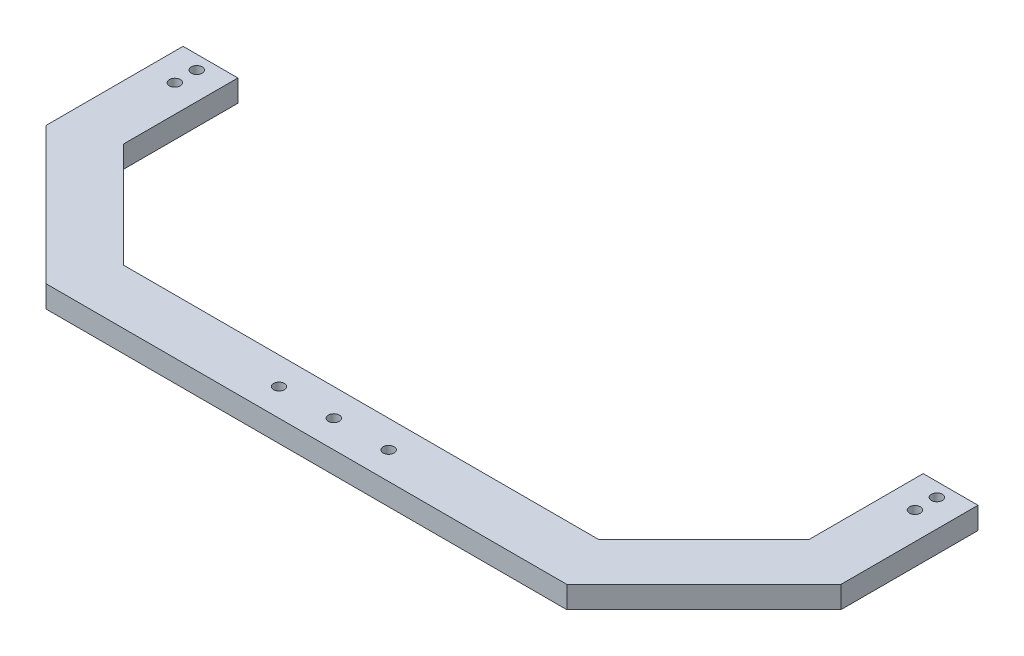
ISO-10303-21;
HEADER;
FILE_DESCRIPTION(('STEP AP214'),'2;1');
FILE_NAME('part.step','',(''),(''),'','','');
FILE_SCHEMA(('AUTOMOTIVE_DESIGN { 1 0 10303 214 1 1 1 1 }'));
ENDSEC;
DATA;
#1=APPLICATION_CONTEXT('core data for automotive mechanical design processes');
#2=APPLICATION_PROTOCOL_DEFINITION('international standard','automotive_design',2000,#1);
#3=PRODUCT_CONTEXT('',#1,'mechanical');
#4=PRODUCT('Part','Part','',(#3));
#5=PRODUCT_RELATED_PRODUCT_CATEGORY('part','',(#4));
#6=PRODUCT_DEFINITION_FORMATION('','',#4);
#7=PRODUCT_DEFINITION_CONTEXT('part definition',#1,'design');
#8=PRODUCT_DEFINITION('design','',#6,#7);
#9=PRODUCT_DEFINITION_SHAPE('','',#8);
#10=(LENGTH_UNIT() NAMED_UNIT(*) SI_UNIT(.MILLI.,.METRE.));
#11=(NAMED_UNIT(*) PLANE_ANGLE_UNIT() SI_UNIT($,.RADIAN.));
#12=(NAMED_UNIT(*) SI_UNIT($,.STERADIAN.) SOLID_ANGLE_UNIT());
#13=UNCERTAINTY_MEASURE_WITH_UNIT(LENGTH_MEASURE(1.E-05),#10,'distance_accuracy_value','');
#14=(GEOMETRIC_REPRESENTATION_CONTEXT(3) GLOBAL_UNCERTAINTY_ASSIGNED_CONTEXT((#13)) GLOBAL_UNIT_ASSIGNED_CONTEXT((#10,
#11,#12)) REPRESENTATION_CONTEXT('',''));
#15=CARTESIAN_POINT('',(0.,0.,0.));
#16=DIRECTION('',(0.,0.,1.));
#17=DIRECTION('',(1.,0.,0.));
#18=AXIS2_PLACEMENT_3D('',#15,#16,#17);
#19=CARTESIAN_POINT('',(0.,4.,0.));
#20=DIRECTION('',(0.,1.,0.));
#21=DIRECTION('',(0.,0.,1.));
#22=AXIS2_PLACEMENT_3D('',#19,#20,#21);
#23=PLANE('',#22);
#24=CARTESIAN_POINT('',(-67.5,4.,-47.5));
#25=DIRECTION('',(0.,1.,0.));
#26=DIRECTION('',(0.,0.,-1.));
#27=AXIS2_PLACEMENT_3D('',#24,#25,#26);
#28=CIRCLE('',#27,0.999999999999998);
#29=CARTESIAN_POINT('',(-67.5,4.,-48.5));
#30=VERTEX_POINT('',#29);
#31=EDGE_CURVE('E285',#30,#30,#28,.T.);
#32=ORIENTED_EDGE('',*,*,#31,.F.);
#33=EDGE_LOOP('',(#32));
#34=FACE_BOUND('',#33,.T.);
#35=CARTESIAN_POINT('',(-67.4999999999999,4.,-43.5));
#36=DIRECTION('',(0.,1.,0.));
#37=DIRECTION('',(0.,0.,-1.));
#38=AXIS2_PLACEMENT_3D('',#35,#36,#37);
#39=CIRCLE('',#38,0.999999999999998);
#40=CARTESIAN_POINT('',(-67.4999999999999,4.,-44.5));
#41=VERTEX_POINT('',#40);
#42=EDGE_CURVE('E288',#41,#41,#39,.T.);
#43=ORIENTED_EDGE('',*,*,#42,.F.);
#44=EDGE_LOOP('',(#43));
#45=FACE_BOUND('',#44,.T.);
#46=CARTESIAN_POINT('',(67.4999999999999,4.,-43.5));
#47=DIRECTION('',(0.,1.,0.));
#48=DIRECTION('',(0.,0.,1.));
#49=AXIS2_PLACEMENT_3D('',#46,#47,#48);
#50=CIRCLE('',#49,0.999999999999998);
#51=CARTESIAN_POINT('',(67.4999999999999,4.,-42.5));
#52=VERTEX_POINT('',#51);
#53=EDGE_CURVE('E277',#52,#52,#50,.T.);
#54=ORIENTED_EDGE('',*,*,#53,.F.);
#55=EDGE_LOOP('',(#54));
#56=FACE_BOUND('',#55,.T.);
#57=CARTESIAN_POINT('',(67.5,4.,-47.5));
#58=DIRECTION('',(0.,1.,0.));
#59=DIRECTION('',(0.,0.,1.));
#60=AXIS2_PLACEMENT_3D('',#57,#58,#59);
#61=CIRCLE('',#60,0.999999999999998);
#62=CARTESIAN_POINT('',(67.5,4.,-46.5));
#63=VERTEX_POINT('',#62);
#64=EDGE_CURVE('E272',#63,#63,#61,.T.);
#65=ORIENTED_EDGE('',*,*,#64,.F.);
#66=EDGE_LOOP('',(#65));
#67=FACE_BOUND('',#66,.T.);
#68=CARTESIAN_POINT('',(0.,4.,-5.));
#69=DIRECTION('',(0.,1.,0.));
#70=DIRECTION('',(0.,0.,1.));
#71=AXIS2_PLACEMENT_3D('',#68,#69,#70);
#72=CIRCLE('',#71,1.);
#73=CARTESIAN_POINT('',(0.,4.,-4.));
#74=VERTEX_POINT('',#73);
#75=EDGE_CURVE('E256',#74,#74,#72,.T.);
#76=ORIENTED_EDGE('',*,*,#75,.F.);
#77=EDGE_LOOP('',(#76));
#78=FACE_BOUND('',#77,.T.);
#79=DIRECTION('',(0.707106781186546,0.,-0.707106781186549));
#80=VECTOR('',#79,1.);
#81=CARTESIAN_POINT('',(47.5000000000001,4.,0.));
#82=LINE('',#81,#80);
#83=CARTESIAN_POINT('',(47.5000000000001,4.,0.));
#84=VERTEX_POINT('',#83);
#85=CARTESIAN_POINT('',(72.4999999999999,4.,-25.));
#86=VERTEX_POINT('',#85);
#87=EDGE_CURVE('E187',#84,#86,#82,.T.);
#88=ORIENTED_EDGE('',*,*,#87,.T.);
#89=DIRECTION('',(0.,0.,-1.));
#90=VECTOR('',#89,1.);
#91=CARTESIAN_POINT('',(72.4999999999999,4.,-25.));
#92=LINE('',#91,#90);
#93=CARTESIAN_POINT('',(72.5,4.,-50.));
#94=VERTEX_POINT('',#93);
#95=EDGE_CURVE('E108',#86,#94,#92,.T.);
#96=ORIENTED_EDGE('',*,*,#95,.T.);
#97=DIRECTION('',(-1.,0.,0.));
#98=VECTOR('',#97,1.);
#99=CARTESIAN_POINT('',(72.5,4.,-50.));
#100=LINE('',#99,#98);
#101=CARTESIAN_POINT('',(62.5,4.,-50.));
#102=VERTEX_POINT('',#101);
#103=EDGE_CURVE('E213',#94,#102,#100,.T.);
#104=ORIENTED_EDGE('',*,*,#103,.T.);
#105=DIRECTION('',(0.,0.,1.));
#106=VECTOR('',#105,1.);
#107=CARTESIAN_POINT('',(62.5,4.,-29.1421356237309));
#108=LINE('',#107,#106);
#109=CARTESIAN_POINT('',(62.5,4.,-29.1421356237309));
#110=VERTEX_POINT('',#109);
#111=EDGE_CURVE('E226',#102,#110,#108,.T.);
#112=ORIENTED_EDGE('',*,*,#111,.T.);
#113=DIRECTION('',(-0.707106781186546,0.,0.707106781186549));
#114=VECTOR('',#113,1.);
#115=CARTESIAN_POINT('',(43.3578643762691,4.,-10.));
#116=LINE('',#115,#114);
#117=CARTESIAN_POINT('',(43.3578643762691,4.,-10.));
#118=VERTEX_POINT('',#117);
#119=EDGE_CURVE('E227',#110,#118,#116,.T.);
#120=ORIENTED_EDGE('',*,*,#119,.T.);
#121=DIRECTION('',(-1.,0.,0.));
#122=VECTOR('',#121,1.);
#123=CARTESIAN_POINT('',(0.,4.,-10.));
#124=LINE('',#123,#122);
#125=CARTESIAN_POINT('',(-43.3578643762691,4.,-9.99999999999999));
#126=VERTEX_POINT('',#125);
#127=EDGE_CURVE('E229',#118,#126,#124,.T.);
#128=ORIENTED_EDGE('',*,*,#127,.T.);
#129=DIRECTION('',(-0.707106781186546,0.,-0.707106781186548));
#130=VECTOR('',#129,1.);
#131=CARTESIAN_POINT('',(-43.3578643762691,4.,-9.99999999999999));
#132=LINE('',#131,#130);
#133=CARTESIAN_POINT('',(-62.5,4.,-29.1421356237309));
#134=VERTEX_POINT('',#133);
#135=EDGE_CURVE('E232',#126,#134,#132,.T.);
#136=ORIENTED_EDGE('',*,*,#135,.T.);
#137=DIRECTION('',(0.,0.,-1.));
#138=VECTOR('',#137,1.);
#139=CARTESIAN_POINT('',(-62.5,4.,-29.1421356237309));
#140=LINE('',#139,#138);
#141=CARTESIAN_POINT('',(-62.5,4.,-50.));
#142=VERTEX_POINT('',#141);
#143=EDGE_CURVE('E240',#134,#142,#140,.T.);
#144=ORIENTED_EDGE('',*,*,#143,.T.);
#145=DIRECTION('',(-1.,0.,0.));
#146=VECTOR('',#145,1.);
#147=CARTESIAN_POINT('',(-72.5,4.,-50.));
#148=LINE('',#147,#146);
#149=CARTESIAN_POINT('',(-72.5,4.,-50.));
#150=VERTEX_POINT('',#149);
#151=EDGE_CURVE('E143',#142,#150,#148,.T.);
#152=ORIENTED_EDGE('',*,*,#151,.T.);
#153=DIRECTION('',(0.,0.,1.));
#154=VECTOR('',#153,1.);
#155=CARTESIAN_POINT('',(-72.4999999999999,4.,-25.));
#156=LINE('',#155,#154);
#157=CARTESIAN_POINT('',(-72.4999999999999,4.,-25.));
#158=VERTEX_POINT('',#157);
#159=EDGE_CURVE('E131',#150,#158,#156,.T.);
#160=ORIENTED_EDGE('',*,*,#159,.T.);
#161=DIRECTION('',(0.707106781186546,0.,0.707106781186549));
#162=VECTOR('',#161,1.);
#163=CARTESIAN_POINT('',(-47.5000000000001,4.,0.));
#164=LINE('',#163,#162);
#165=CARTESIAN_POINT('',(-47.5000000000001,4.,0.));
#166=VERTEX_POINT('',#165);
#167=EDGE_CURVE('E138',#158,#166,#164,.T.);
#168=ORIENTED_EDGE('',*,*,#167,.T.);
#169=DIRECTION('',(1.,0.,0.));
#170=VECTOR('',#169,1.);
#171=CARTESIAN_POINT('',(0.,4.,0.));
#172=LINE('',#171,#170);
#173=EDGE_CURVE('E57',#166,#84,#172,.T.);
#174=ORIENTED_EDGE('',*,*,#173,.T.);
#175=EDGE_LOOP('',(#88,#96,#104,#112,#120,#128,#136,#144,#152,#160,#168,#174));
#176=FACE_BOUND('',#175,.T.);
#177=CARTESIAN_POINT('',(10.,4.,-5.));
#178=DIRECTION('',(0.,1.,0.));
#179=DIRECTION('',(0.,0.,1.));
#180=AXIS2_PLACEMENT_3D('',#177,#178,#179);
#181=CIRCLE('',#180,1.);
#182=CARTESIAN_POINT('',(10.,4.,-4.));
#183=VERTEX_POINT('',#182);
#184=EDGE_CURVE('E164',#183,#183,#181,.T.);
#185=ORIENTED_EDGE('',*,*,#184,.F.);
#186=EDGE_LOOP('',(#185));
#187=FACE_BOUND('',#186,.T.);
#188=CARTESIAN_POINT('',(-10.,4.,-5.));
#189=DIRECTION('',(0.,1.,0.));
#190=DIRECTION('',(0.,0.,-1.));
#191=AXIS2_PLACEMENT_3D('',#188,#189,#190);
#192=CIRCLE('',#191,1.);
#193=CARTESIAN_POINT('',(-10.,4.,-6.));
#194=VERTEX_POINT('',#193);
#195=EDGE_CURVE('E262',#194,#194,#192,.T.);
#196=ORIENTED_EDGE('',*,*,#195,.F.);
#197=EDGE_LOOP('',(#196));
#198=FACE_BOUND('',#197,.T.);
#199=ADVANCED_FACE('F39',(#34,#45,#56,#67,#78,#176,#187,#198),#23,.T.);
#200=CARTESIAN_POINT('',(0.,0.,0.));
#201=DIRECTION('',(0.,1.,0.));
#202=DIRECTION('',(0.,0.,1.));
#203=AXIS2_PLACEMENT_3D('',#200,#201,#202);
#204=PLANE('',#203);
#205=CARTESIAN_POINT('',(-67.5,0.,-47.5));
#206=DIRECTION('',(0.,1.,0.));
#207=DIRECTION('',(0.,0.,-1.));
#208=AXIS2_PLACEMENT_3D('',#205,#206,#207);
#209=CIRCLE('',#208,0.999999999999998);
#210=CARTESIAN_POINT('',(-67.5,0.,-48.5));
#211=VERTEX_POINT('',#210);
#212=EDGE_CURVE('E276',#211,#211,#209,.T.);
#213=ORIENTED_EDGE('',*,*,#212,.T.);
#214=EDGE_LOOP('',(#213));
#215=FACE_BOUND('',#214,.T.);
#216=CARTESIAN_POINT('',(-67.4999999999999,0.,-43.5));
#217=DIRECTION('',(0.,1.,0.));
#218=DIRECTION('',(0.,0.,-1.));
#219=AXIS2_PLACEMENT_3D('',#216,#217,#218);
#220=CIRCLE('',#219,0.999999999999998);
#221=CARTESIAN_POINT('',(-67.4999999999999,0.,-44.5));
#222=VERTEX_POINT('',#221);
#223=EDGE_CURVE('E283',#222,#222,#220,.T.);
#224=ORIENTED_EDGE('',*,*,#223,.T.);
#225=EDGE_LOOP('',(#224));
#226=FACE_BOUND('',#225,.T.);
#227=CARTESIAN_POINT('',(67.4999999999999,0.,-43.5));
#228=DIRECTION('',(0.,1.,0.));
#229=DIRECTION('',(0.,0.,1.));
#230=AXIS2_PLACEMENT_3D('',#227,#228,#229);
#231=CIRCLE('',#230,0.999999999999998);
#232=CARTESIAN_POINT('',(67.4999999999999,0.,-42.5));
#233=VERTEX_POINT('',#232);
#234=EDGE_CURVE('E292',#233,#233,#231,.T.);
#235=ORIENTED_EDGE('',*,*,#234,.T.);
#236=EDGE_LOOP('',(#235));
#237=FACE_BOUND('',#236,.T.);
#238=CARTESIAN_POINT('',(67.5,0.,-47.5));
#239=DIRECTION('',(0.,1.,0.));
#240=DIRECTION('',(0.,0.,1.));
#241=AXIS2_PLACEMENT_3D('',#238,#239,#240);
#242=CIRCLE('',#241,0.999999999999998);
#243=CARTESIAN_POINT('',(67.5,0.,-46.5));
#244=VERTEX_POINT('',#243);
#245=EDGE_CURVE('E269',#244,#244,#242,.T.);
#246=ORIENTED_EDGE('',*,*,#245,.T.);
#247=EDGE_LOOP('',(#246));
#248=FACE_BOUND('',#247,.T.);
#249=DIRECTION('',(0.707106781186546,0.,-0.707106781186549));
#250=VECTOR('',#249,1.);
#251=CARTESIAN_POINT('',(47.5000000000001,0.,0.));
#252=LINE('',#251,#250);
#253=CARTESIAN_POINT('',(47.5000000000001,0.,0.));
#254=VERTEX_POINT('',#253);
#255=CARTESIAN_POINT('',(72.4999999999999,0.,-25.));
#256=VERTEX_POINT('',#255);
#257=EDGE_CURVE('E161',#254,#256,#252,.T.);
#258=ORIENTED_EDGE('',*,*,#257,.F.);
#259=DIRECTION('',(1.,0.,0.));
#260=VECTOR('',#259,1.);
#261=CARTESIAN_POINT('',(0.,0.,0.));
#262=LINE('',#261,#260);
#263=CARTESIAN_POINT('',(-47.5000000000001,0.,0.));
#264=VERTEX_POINT('',#263);
#265=EDGE_CURVE('E100',#264,#254,#262,.T.);
#266=ORIENTED_EDGE('',*,*,#265,.F.);
#267=DIRECTION('',(0.707106781186546,0.,0.707106781186549));
#268=VECTOR('',#267,1.);
#269=CARTESIAN_POINT('',(-47.5000000000001,0.,0.));
#270=LINE('',#269,#268);
#271=CARTESIAN_POINT('',(-72.4999999999999,0.,-25.));
#272=VERTEX_POINT('',#271);
#273=EDGE_CURVE('E181',#272,#264,#270,.T.);
#274=ORIENTED_EDGE('',*,*,#273,.F.);
#275=DIRECTION('',(0.,0.,1.));
#276=VECTOR('',#275,1.);
#277=CARTESIAN_POINT('',(-72.4999999999999,0.,-25.));
#278=LINE('',#277,#276);
#279=CARTESIAN_POINT('',(-72.5,0.,-50.));
#280=VERTEX_POINT('',#279);
#281=EDGE_CURVE('E147',#280,#272,#278,.T.);
#282=ORIENTED_EDGE('',*,*,#281,.F.);
#283=DIRECTION('',(-1.,0.,0.));
#284=VECTOR('',#283,1.);
#285=CARTESIAN_POINT('',(-72.5,0.,-50.));
#286=LINE('',#285,#284);
#287=CARTESIAN_POINT('',(-62.5,0.,-50.));
#288=VERTEX_POINT('',#287);
#289=EDGE_CURVE('E176',#288,#280,#286,.T.);
#290=ORIENTED_EDGE('',*,*,#289,.F.);
#291=DIRECTION('',(0.,0.,-1.));
#292=VECTOR('',#291,1.);
#293=CARTESIAN_POINT('',(-62.5,0.,-29.1421356237309));
#294=LINE('',#293,#292);
#295=CARTESIAN_POINT('',(-62.5,0.,-29.1421356237309));
#296=VERTEX_POINT('',#295);
#297=EDGE_CURVE('E178',#296,#288,#294,.T.);
#298=ORIENTED_EDGE('',*,*,#297,.F.);
#299=DIRECTION('',(-0.707106781186546,0.,-0.707106781186548));
#300=VECTOR('',#299,1.);
#301=CARTESIAN_POINT('',(-43.3578643762691,0.,-9.99999999999999));
#302=LINE('',#301,#300);
#303=CARTESIAN_POINT('',(-43.3578643762691,0.,-9.99999999999999));
#304=VERTEX_POINT('',#303);
#305=EDGE_CURVE('E177',#304,#296,#302,.T.);
#306=ORIENTED_EDGE('',*,*,#305,.F.);
#307=DIRECTION('',(-1.,0.,0.));
#308=VECTOR('',#307,1.);
#309=CARTESIAN_POINT('',(0.,0.,-10.));
#310=LINE('',#309,#308);
#311=CARTESIAN_POINT('',(43.3578643762691,0.,-10.));
#312=VERTEX_POINT('',#311);
#313=EDGE_CURVE('E171',#312,#304,#310,.T.);
#314=ORIENTED_EDGE('',*,*,#313,.F.);
#315=DIRECTION('',(-0.707106781186546,0.,0.707106781186549));
#316=VECTOR('',#315,1.);
#317=CARTESIAN_POINT('',(43.3578643762691,0.,-10.));
#318=LINE('',#317,#316);
#319=CARTESIAN_POINT('',(62.5,0.,-29.1421356237309));
#320=VERTEX_POINT('',#319);
#321=EDGE_CURVE('E172',#320,#312,#318,.T.);
#322=ORIENTED_EDGE('',*,*,#321,.F.);
#323=DIRECTION('',(0.,0.,1.));
#324=VECTOR('',#323,1.);
#325=CARTESIAN_POINT('',(62.5,0.,-29.1421356237309));
#326=LINE('',#325,#324);
#327=CARTESIAN_POINT('',(62.5,0.,-50.));
#328=VERTEX_POINT('',#327);
#329=EDGE_CURVE('E166',#328,#320,#326,.T.);
#330=ORIENTED_EDGE('',*,*,#329,.F.);
#331=DIRECTION('',(-1.,0.,0.));
#332=VECTOR('',#331,1.);
#333=CARTESIAN_POINT('',(72.5,0.,-50.));
#334=LINE('',#333,#332);
#335=CARTESIAN_POINT('',(72.5,0.,-50.));
#336=VERTEX_POINT('',#335);
#337=EDGE_CURVE('E170',#336,#328,#334,.T.);
#338=ORIENTED_EDGE('',*,*,#337,.F.);
#339=DIRECTION('',(0.,0.,-1.));
#340=VECTOR('',#339,1.);
#341=CARTESIAN_POINT('',(72.4999999999999,0.,-25.));
#342=LINE('',#341,#340);
#343=EDGE_CURVE('E163',#256,#336,#342,.T.);
#344=ORIENTED_EDGE('',*,*,#343,.F.);
#345=EDGE_LOOP('',(#258,#266,#274,#282,#290,#298,#306,#314,#322,#330,#338,#344));
#346=FACE_BOUND('',#345,.T.);
#347=CARTESIAN_POINT('',(10.,0.,-5.));
#348=DIRECTION('',(0.,1.,0.));
#349=DIRECTION('',(0.,0.,1.));
#350=AXIS2_PLACEMENT_3D('',#347,#348,#349);
#351=CIRCLE('',#350,1.);
#352=CARTESIAN_POINT('',(10.,0.,-4.));
#353=VERTEX_POINT('',#352);
#354=EDGE_CURVE('E254',#353,#353,#351,.T.);
#355=ORIENTED_EDGE('',*,*,#354,.T.);
#356=EDGE_LOOP('',(#355));
#357=FACE_BOUND('',#356,.T.);
#358=CARTESIAN_POINT('',(0.,0.,-5.));
#359=DIRECTION('',(0.,1.,0.));
#360=DIRECTION('',(0.,0.,1.));
#361=AXIS2_PLACEMENT_3D('',#358,#359,#360);
#362=CIRCLE('',#361,1.);
#363=CARTESIAN_POINT('',(0.,0.,-4.));
#364=VERTEX_POINT('',#363);
#365=EDGE_CURVE('E261',#364,#364,#362,.T.);
#366=ORIENTED_EDGE('',*,*,#365,.T.);
#367=EDGE_LOOP('',(#366));
#368=FACE_BOUND('',#367,.T.);
#369=CARTESIAN_POINT('',(-10.,0.,-5.));
#370=DIRECTION('',(0.,1.,0.));
#371=DIRECTION('',(0.,0.,-1.));
#372=AXIS2_PLACEMENT_3D('',#369,#370,#371);
#373=CIRCLE('',#372,1.);
#374=CARTESIAN_POINT('',(-10.,0.,-6.));
#375=VERTEX_POINT('',#374);
#376=EDGE_CURVE('E270',#375,#375,#373,.T.);
#377=ORIENTED_EDGE('',*,*,#376,.T.);
#378=EDGE_LOOP('',(#377));
#379=FACE_BOUND('',#378,.T.);
#380=ADVANCED_FACE('F214',(#215,#226,#237,#248,#346,#357,#368,#379),#204,.F.);
#381=CARTESIAN_POINT('',(47.5000000000001,4.,0.));
#382=DIRECTION('',(-0.707106781186549,0.,-0.707106781186546));
#383=DIRECTION('',(-0.707106781186546,0.,0.707106781186549));
#384=AXIS2_PLACEMENT_3D('',#381,#382,#383);
#385=PLANE('',#384);
#386=ORIENTED_EDGE('',*,*,#257,.T.);
#387=DIRECTION('',(0.,-1.,0.));
#388=VECTOR('',#387,1.);
#389=CARTESIAN_POINT('',(72.4999999999999,4.,-25.));
#390=LINE('',#389,#388);
#391=EDGE_CURVE('E11',#86,#256,#390,.T.);
#392=ORIENTED_EDGE('',*,*,#391,.F.);
#393=ORIENTED_EDGE('',*,*,#87,.F.);
#394=DIRECTION('',(0.,-1.,0.));
#395=VECTOR('',#394,1.);
#396=CARTESIAN_POINT('',(47.5000000000001,4.,0.));
#397=LINE('',#396,#395);
#398=EDGE_CURVE('E160',#84,#254,#397,.T.);
#399=ORIENTED_EDGE('',*,*,#398,.T.);
#400=EDGE_LOOP('',(#386,#392,#393,#399));
#401=FACE_BOUND('',#400,.T.);
#402=ADVANCED_FACE('F41',(#401),#385,.F.);
#403=CARTESIAN_POINT('',(72.4999999999999,4.,-25.));
#404=DIRECTION('',(-1.,0.,0.));
#405=DIRECTION('',(0.,0.,1.));
#406=AXIS2_PLACEMENT_3D('',#403,#404,#405);
#407=PLANE('',#406);
#408=ORIENTED_EDGE('',*,*,#343,.T.);
#409=DIRECTION('',(0.,-1.,0.));
#410=VECTOR('',#409,1.);
#411=CARTESIAN_POINT('',(72.5,4.,-50.));
#412=LINE('',#411,#410);
#413=EDGE_CURVE('E48',#94,#336,#412,.T.);
#414=ORIENTED_EDGE('',*,*,#413,.F.);
#415=ORIENTED_EDGE('',*,*,#95,.F.);
#416=ORIENTED_EDGE('',*,*,#391,.T.);
#417=EDGE_LOOP('',(#408,#414,#415,#416));
#418=FACE_BOUND('',#417,.T.);
#419=ADVANCED_FACE('F358',(#418),#407,.F.);
#420=CARTESIAN_POINT('',(72.5,4.,-50.));
#421=DIRECTION('',(0.,0.,1.));
#422=DIRECTION('',(1.,0.,0.));
#423=AXIS2_PLACEMENT_3D('',#420,#421,#422);
#424=PLANE('',#423);
#425=ORIENTED_EDGE('',*,*,#337,.T.);
#426=DIRECTION('',(0.,-1.,0.));
#427=VECTOR('',#426,1.);
#428=CARTESIAN_POINT('',(62.5,4.,-50.));
#429=LINE('',#428,#427);
#430=EDGE_CURVE('E202',#102,#328,#429,.T.);
#431=ORIENTED_EDGE('',*,*,#430,.F.);
#432=ORIENTED_EDGE('',*,*,#103,.F.);
#433=ORIENTED_EDGE('',*,*,#413,.T.);
#434=EDGE_LOOP('',(#425,#431,#432,#433));
#435=FACE_BOUND('',#434,.T.);
#436=ADVANCED_FACE('F211',(#435),#424,.F.);
#437=CARTESIAN_POINT('',(62.5,4.,-29.1421356237309));
#438=DIRECTION('',(1.,0.,0.));
#439=DIRECTION('',(0.,0.,-1.));
#440=AXIS2_PLACEMENT_3D('',#437,#438,#439);
#441=PLANE('',#440);
#442=ORIENTED_EDGE('',*,*,#329,.T.);
#443=DIRECTION('',(0.,-1.,0.));
#444=VECTOR('',#443,1.);
#445=CARTESIAN_POINT('',(62.5,4.,-29.1421356237309));
#446=LINE('',#445,#444);
#447=EDGE_CURVE('E205',#110,#320,#446,.T.);
#448=ORIENTED_EDGE('',*,*,#447,.F.);
#449=ORIENTED_EDGE('',*,*,#111,.F.);
#450=ORIENTED_EDGE('',*,*,#430,.T.);
#451=EDGE_LOOP('',(#442,#448,#449,#450));
#452=FACE_BOUND('',#451,.T.);
#453=ADVANCED_FACE('F219',(#452),#441,.F.);
#454=CARTESIAN_POINT('',(43.3578643762691,4.,-10.));
#455=DIRECTION('',(0.707106781186549,0.,0.707106781186546));
#456=DIRECTION('',(0.707106781186546,0.,-0.707106781186549));
#457=AXIS2_PLACEMENT_3D('',#454,#455,#456);
#458=PLANE('',#457);
#459=ORIENTED_EDGE('',*,*,#321,.T.);
#460=DIRECTION('',(0.,-1.,0.));
#461=VECTOR('',#460,1.);
#462=CARTESIAN_POINT('',(43.3578643762691,4.,-10.));
#463=LINE('',#462,#461);
#464=EDGE_CURVE('E200',#118,#312,#463,.T.);
#465=ORIENTED_EDGE('',*,*,#464,.F.);
#466=ORIENTED_EDGE('',*,*,#119,.F.);
#467=ORIENTED_EDGE('',*,*,#447,.T.);
#468=EDGE_LOOP('',(#459,#465,#466,#467));
#469=FACE_BOUND('',#468,.T.);
#470=ADVANCED_FACE('F221',(#469),#458,.F.);
#471=CARTESIAN_POINT('',(0.,4.,-10.));
#472=DIRECTION('',(0.,0.,1.));
#473=DIRECTION('',(1.,0.,0.));
#474=AXIS2_PLACEMENT_3D('',#471,#472,#473);
#475=PLANE('',#474);
#476=ORIENTED_EDGE('',*,*,#313,.T.);
#477=DIRECTION('',(0.,-1.,0.));
#478=VECTOR('',#477,1.);
#479=CARTESIAN_POINT('',(-43.3578643762691,4.,-9.99999999999999));
#480=LINE('',#479,#478);
#481=EDGE_CURVE('E198',#126,#304,#480,.T.);
#482=ORIENTED_EDGE('',*,*,#481,.F.);
#483=ORIENTED_EDGE('',*,*,#127,.F.);
#484=ORIENTED_EDGE('',*,*,#464,.T.);
#485=EDGE_LOOP('',(#476,#482,#483,#484));
#486=FACE_BOUND('',#485,.T.);
#487=ADVANCED_FACE('F346',(#486),#475,.F.);
#488=CARTESIAN_POINT('',(-43.3578643762691,4.,-9.99999999999999));
#489=DIRECTION('',(-0.707106781186549,0.,0.707106781186546));
#490=DIRECTION('',(0.707106781186546,0.,0.707106781186549));
#491=AXIS2_PLACEMENT_3D('',#488,#489,#490);
#492=PLANE('',#491);
#493=ORIENTED_EDGE('',*,*,#305,.T.);
#494=DIRECTION('',(0.,-1.,0.));
#495=VECTOR('',#494,1.);
#496=CARTESIAN_POINT('',(-62.5,4.,-29.1421356237309));
#497=LINE('',#496,#495);
#498=EDGE_CURVE('E193',#134,#296,#497,.T.);
#499=ORIENTED_EDGE('',*,*,#498,.F.);
#500=ORIENTED_EDGE('',*,*,#135,.F.);
#501=ORIENTED_EDGE('',*,*,#481,.T.);
#502=EDGE_LOOP('',(#493,#499,#500,#501));
#503=FACE_BOUND('',#502,.T.);
#504=ADVANCED_FACE('F341',(#503),#492,.F.);
#505=CARTESIAN_POINT('',(-62.5,4.,-29.1421356237309));
#506=DIRECTION('',(-1.,0.,0.));
#507=DIRECTION('',(0.,0.,1.));
#508=AXIS2_PLACEMENT_3D('',#505,#506,#507);
#509=PLANE('',#508);
#510=ORIENTED_EDGE('',*,*,#297,.T.);
#511=DIRECTION('',(0.,-1.,0.));
#512=VECTOR('',#511,1.);
#513=CARTESIAN_POINT('',(-62.5,4.,-50.));
#514=LINE('',#513,#512);
#515=EDGE_CURVE('E188',#142,#288,#514,.T.);
#516=ORIENTED_EDGE('',*,*,#515,.F.);
#517=ORIENTED_EDGE('',*,*,#143,.F.);
#518=ORIENTED_EDGE('',*,*,#498,.T.);
#519=EDGE_LOOP('',(#510,#516,#517,#518));
#520=FACE_BOUND('',#519,.T.);
#521=ADVANCED_FACE('F244',(#520),#509,.F.);
#522=CARTESIAN_POINT('',(-72.5,4.,-50.));
#523=DIRECTION('',(0.,0.,1.));
#524=DIRECTION('',(1.,0.,0.));
#525=AXIS2_PLACEMENT_3D('',#522,#523,#524);
#526=PLANE('',#525);
#527=ORIENTED_EDGE('',*,*,#289,.T.);
#528=DIRECTION('',(0.,-1.,0.));
#529=VECTOR('',#528,1.);
#530=CARTESIAN_POINT('',(-72.5,4.,-50.));
#531=LINE('',#530,#529);
#532=EDGE_CURVE('E155',#150,#280,#531,.T.);
#533=ORIENTED_EDGE('',*,*,#532,.F.);
#534=ORIENTED_EDGE('',*,*,#151,.F.);
#535=ORIENTED_EDGE('',*,*,#515,.T.);
#536=EDGE_LOOP('',(#527,#533,#534,#535));
#537=FACE_BOUND('',#536,.T.);
#538=ADVANCED_FACE('F250',(#537),#526,.F.);
#539=CARTESIAN_POINT('',(-72.4999999999999,4.,-25.));
#540=DIRECTION('',(1.,0.,0.));
#541=DIRECTION('',(0.,0.,-1.));
#542=AXIS2_PLACEMENT_3D('',#539,#540,#541);
#543=PLANE('',#542);
#544=ORIENTED_EDGE('',*,*,#281,.T.);
#545=DIRECTION('',(0.,-1.,0.));
#546=VECTOR('',#545,1.);
#547=CARTESIAN_POINT('',(-72.4999999999999,4.,-25.));
#548=LINE('',#547,#546);
#549=EDGE_CURVE('E150',#158,#272,#548,.T.);
#550=ORIENTED_EDGE('',*,*,#549,.F.);
#551=ORIENTED_EDGE('',*,*,#159,.F.);
#552=ORIENTED_EDGE('',*,*,#532,.T.);
#553=EDGE_LOOP('',(#544,#550,#551,#552));
#554=FACE_BOUND('',#553,.T.);
#555=ADVANCED_FACE('F146',(#554),#543,.F.);
#556=CARTESIAN_POINT('',(-47.5000000000001,4.,0.));
#557=DIRECTION('',(0.707106781186549,0.,-0.707106781186546));
#558=DIRECTION('',(-0.707106781186546,0.,-0.707106781186549));
#559=AXIS2_PLACEMENT_3D('',#556,#557,#558);
#560=PLANE('',#559);
#561=ORIENTED_EDGE('',*,*,#273,.T.);
#562=DIRECTION('',(0.,-1.,0.));
#563=VECTOR('',#562,1.);
#564=CARTESIAN_POINT('',(-47.5000000000001,4.,0.));
#565=LINE('',#564,#563);
#566=EDGE_CURVE('E153',#166,#264,#565,.T.);
#567=ORIENTED_EDGE('',*,*,#566,.F.);
#568=ORIENTED_EDGE('',*,*,#167,.F.);
#569=ORIENTED_EDGE('',*,*,#549,.T.);
#570=EDGE_LOOP('',(#561,#567,#568,#569));
#571=FACE_BOUND('',#570,.T.);
#572=ADVANCED_FACE('F154',(#571),#560,.F.);
#573=CARTESIAN_POINT('',(0.,4.,0.));
#574=DIRECTION('',(0.,0.,-1.));
#575=DIRECTION('',(-1.,0.,0.));
#576=AXIS2_PLACEMENT_3D('',#573,#574,#575);
#577=PLANE('',#576);
#578=ORIENTED_EDGE('',*,*,#265,.T.);
#579=ORIENTED_EDGE('',*,*,#398,.F.);
#580=ORIENTED_EDGE('',*,*,#173,.F.);
#581=ORIENTED_EDGE('',*,*,#566,.T.);
#582=EDGE_LOOP('',(#578,#579,#580,#581));
#583=FACE_BOUND('',#582,.T.);
#584=ADVANCED_FACE('F248',(#583),#577,.F.);
#585=CARTESIAN_POINT('',(10.,4.,-5.));
#586=DIRECTION('',(0.,-1.,0.));
#587=DIRECTION('',(0.,0.,-1.));
#588=AXIS2_PLACEMENT_3D('',#585,#586,#587);
#589=CYLINDRICAL_SURFACE('',#588,1.);
#590=ORIENTED_EDGE('',*,*,#184,.T.);
#591=EDGE_LOOP('',(#590));
#592=FACE_BOUND('',#591,.T.);
#593=ORIENTED_EDGE('',*,*,#354,.F.);
#594=EDGE_LOOP('',(#593));
#595=FACE_BOUND('',#594,.T.);
#596=ADVANCED_FACE('F313',(#592,#595),#589,.F.);
#597=CARTESIAN_POINT('',(0.,4.,-5.));
#598=DIRECTION('',(0.,-1.,0.));
#599=DIRECTION('',(0.,0.,-1.));
#600=AXIS2_PLACEMENT_3D('',#597,#598,#599);
#601=CYLINDRICAL_SURFACE('',#600,1.);
#602=ORIENTED_EDGE('',*,*,#75,.T.);
#603=EDGE_LOOP('',(#602));
#604=FACE_BOUND('',#603,.T.);
#605=ORIENTED_EDGE('',*,*,#365,.F.);
#606=EDGE_LOOP('',(#605));
#607=FACE_BOUND('',#606,.T.);
#608=ADVANCED_FACE('F307',(#604,#607),#601,.F.);
#609=CARTESIAN_POINT('',(-10.,4.,-5.));
#610=DIRECTION('',(0.,-1.,0.));
#611=DIRECTION('',(0.,0.,-1.));
#612=AXIS2_PLACEMENT_3D('',#609,#610,#611);
#613=CYLINDRICAL_SURFACE('',#612,1.);
#614=ORIENTED_EDGE('',*,*,#195,.T.);
#615=EDGE_LOOP('',(#614));
#616=FACE_BOUND('',#615,.T.);
#617=ORIENTED_EDGE('',*,*,#376,.F.);
#618=EDGE_LOOP('',(#617));
#619=FACE_BOUND('',#618,.T.);
#620=ADVANCED_FACE('F309',(#616,#619),#613,.F.);
#621=CARTESIAN_POINT('',(67.5,0.,-47.5));
#622=DIRECTION('',(0.,1.,0.));
#623=DIRECTION('',(0.,0.,1.));
#624=AXIS2_PLACEMENT_3D('',#621,#622,#623);
#625=CYLINDRICAL_SURFACE('',#624,0.999999999999998);
#626=ORIENTED_EDGE('',*,*,#245,.F.);
#627=EDGE_LOOP('',(#626));
#628=FACE_BOUND('',#627,.T.);
#629=ORIENTED_EDGE('',*,*,#64,.T.);
#630=EDGE_LOOP('',(#629));
#631=FACE_BOUND('',#630,.T.);
#632=ADVANCED_FACE('F325',(#628,#631),#625,.F.);
#633=CARTESIAN_POINT('',(67.4999999999999,0.,-43.5));
#634=DIRECTION('',(0.,1.,0.));
#635=DIRECTION('',(0.,0.,1.));
#636=AXIS2_PLACEMENT_3D('',#633,#634,#635);
#637=CYLINDRICAL_SURFACE('',#636,0.999999999999998);
#638=ORIENTED_EDGE('',*,*,#234,.F.);
#639=EDGE_LOOP('',(#638));
#640=FACE_BOUND('',#639,.T.);
#641=ORIENTED_EDGE('',*,*,#53,.T.);
#642=EDGE_LOOP('',(#641));
#643=FACE_BOUND('',#642,.T.);
#644=ADVANCED_FACE('F300',(#640,#643),#637,.F.);
#645=CARTESIAN_POINT('',(-67.4999999999999,0.,-43.5));
#646=DIRECTION('',(0.,1.,0.));
#647=DIRECTION('',(0.,0.,1.));
#648=AXIS2_PLACEMENT_3D('',#645,#646,#647);
#649=CYLINDRICAL_SURFACE('',#648,0.999999999999998);
#650=ORIENTED_EDGE('',*,*,#223,.F.);
#651=EDGE_LOOP('',(#650));
#652=FACE_BOUND('',#651,.T.);
#653=ORIENTED_EDGE('',*,*,#42,.T.);
#654=EDGE_LOOP('',(#653));
#655=FACE_BOUND('',#654,.T.);
#656=ADVANCED_FACE('F472',(#652,#655),#649,.F.);
#657=CARTESIAN_POINT('',(-67.5,0.,-47.5));
#658=DIRECTION('',(0.,1.,0.));
#659=DIRECTION('',(0.,0.,1.));
#660=AXIS2_PLACEMENT_3D('',#657,#658,#659);
#661=CYLINDRICAL_SURFACE('',#660,0.999999999999998);
#662=ORIENTED_EDGE('',*,*,#212,.F.);
#663=EDGE_LOOP('',(#662));
#664=FACE_BOUND('',#663,.T.);
#665=ORIENTED_EDGE('',*,*,#31,.T.);
#666=EDGE_LOOP('',(#665));
#667=FACE_BOUND('',#666,.T.);
#668=ADVANCED_FACE('F485',(#664,#667),#661,.F.);
#669=CLOSED_SHELL('',(#199,#380,#402,#419,#436,#453,#470,#487,#504,#521,#538,#555,#572,#584,
#596,#608,#620,#632,#644,#656,#668));
#670=MANIFOLD_SOLID_BREP('B2',#669);
#671=ADVANCED_BREP_SHAPE_REPRESENTATION('',(#18,#670),#14);
#672=SHAPE_DEFINITION_REPRESENTATION(#9,#671);
ENDSEC;
END-ISO-10303-21;
